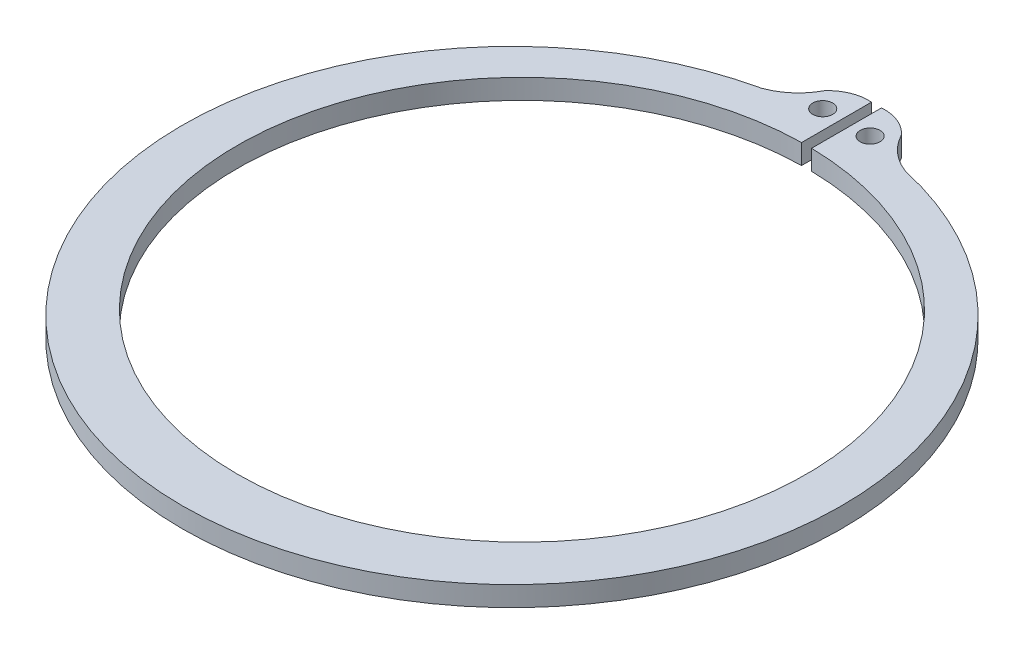
ISO-10303-21;
HEADER;
FILE_DESCRIPTION(('STEP AP214'),'2;1');
FILE_NAME('part.step','',(''),(''),'','','');
FILE_SCHEMA(('AUTOMOTIVE_DESIGN { 1 0 10303 214 1 1 1 1 }'));
ENDSEC;
DATA;
#1=APPLICATION_CONTEXT('core data for automotive mechanical design processes');
#2=APPLICATION_PROTOCOL_DEFINITION('international standard','automotive_design',2000,#1);
#3=PRODUCT_CONTEXT('',#1,'mechanical');
#4=PRODUCT('Part','Part','',(#3));
#5=PRODUCT_RELATED_PRODUCT_CATEGORY('part','',(#4));
#6=PRODUCT_DEFINITION_FORMATION('','',#4);
#7=PRODUCT_DEFINITION_CONTEXT('part definition',#1,'design');
#8=PRODUCT_DEFINITION('design','',#6,#7);
#9=PRODUCT_DEFINITION_SHAPE('','',#8);
#10=(LENGTH_UNIT() NAMED_UNIT(*) SI_UNIT(.MILLI.,.METRE.));
#11=(NAMED_UNIT(*) PLANE_ANGLE_UNIT() SI_UNIT($,.RADIAN.));
#12=(NAMED_UNIT(*) SI_UNIT($,.STERADIAN.) SOLID_ANGLE_UNIT());
#13=UNCERTAINTY_MEASURE_WITH_UNIT(LENGTH_MEASURE(1.E-05),#10,'distance_accuracy_value','');
#14=(GEOMETRIC_REPRESENTATION_CONTEXT(3) GLOBAL_UNCERTAINTY_ASSIGNED_CONTEXT((#13)) GLOBAL_UNIT_ASSIGNED_CONTEXT((#10,
#11,#12)) REPRESENTATION_CONTEXT('',''));
#15=CARTESIAN_POINT('',(0.,0.,0.));
#16=DIRECTION('',(0.,0.,1.));
#17=DIRECTION('',(1.,0.,0.));
#18=AXIS2_PLACEMENT_3D('',#15,#16,#17);
#19=CARTESIAN_POINT('',(-0.812688753312583,2.,-31.472507166047));
#20=DIRECTION('',(0.,-1.,0.));
#21=DIRECTION('',(0.,0.,-1.));
#22=AXIS2_PLACEMENT_3D('',#19,#20,#21);
#23=CYLINDRICAL_SURFACE('',#22,4.03523982190281);
#24=CARTESIAN_POINT('',(-0.812688753312583,0.,-31.472507166047));
#25=DIRECTION('',(0.,1.,0.));
#26=DIRECTION('',(0.,0.,1.));
#27=AXIS2_PLACEMENT_3D('',#24,#25,#26);
#28=CIRCLE('',#27,4.03523982190281);
#29=CARTESIAN_POINT('',(-0.5,0.,-35.49561369755));
#30=VERTEX_POINT('',#29);
#31=CARTESIAN_POINT('',(-3.84861750011484,0.,-34.1307579188185));
#32=VERTEX_POINT('',#31);
#33=EDGE_CURVE('E129',#30,#32,#28,.T.);
#34=ORIENTED_EDGE('',*,*,#33,.T.);
#35=DIRECTION('',(0.,-1.,0.));
#36=VECTOR('',#35,1.);
#37=CARTESIAN_POINT('',(-3.84861750011484,2.,-34.1307579188185));
#38=LINE('',#37,#36);
#39=CARTESIAN_POINT('',(-3.84861750011484,2.,-34.1307579188185));
#40=VERTEX_POINT('',#39);
#41=EDGE_CURVE('E11',#40,#32,#38,.T.);
#42=ORIENTED_EDGE('',*,*,#41,.F.);
#43=CARTESIAN_POINT('',(-0.812688753312583,2.,-31.472507166047));
#44=DIRECTION('',(0.,1.,0.));
#45=DIRECTION('',(0.,0.,1.));
#46=AXIS2_PLACEMENT_3D('',#43,#44,#45);
#47=CIRCLE('',#46,4.03523982190281);
#48=CARTESIAN_POINT('',(-0.5,2.,-35.49561369755));
#49=VERTEX_POINT('',#48);
#50=EDGE_CURVE('E144',#49,#40,#47,.T.);
#51=ORIENTED_EDGE('',*,*,#50,.F.);
#52=DIRECTION('',(0.,-1.,0.));
#53=VECTOR('',#52,1.);
#54=CARTESIAN_POINT('',(-0.5,2.,-35.49561369755));
#55=LINE('',#54,#53);
#56=EDGE_CURVE('E125',#49,#30,#55,.T.);
#57=ORIENTED_EDGE('',*,*,#56,.T.);
#58=EDGE_LOOP('',(#34,#42,#51,#57));
#59=FACE_BOUND('',#58,.T.);
#60=ADVANCED_FACE('F33',(#59),#23,.T.);
#61=CARTESIAN_POINT('',(-9.34814744340769,2.,-37.0386555394674));
#62=DIRECTION('',(0.,-1.,0.));
#63=DIRECTION('',(0.,0.,-1.));
#64=AXIS2_PLACEMENT_3D('',#61,#62,#63);
#65=CYLINDRICAL_SURFACE('',#64,6.22098852027157);
#66=CARTESIAN_POINT('',(-9.34814744340769,0.,-37.0386555394674));
#67=DIRECTION('',(0.,-1.,0.));
#68=DIRECTION('',(0.,0.,-1.));
#69=AXIS2_PLACEMENT_3D('',#66,#67,#68);
#70=CIRCLE('',#69,6.22098852027157);
#71=CARTESIAN_POINT('',(-7.16857951198491,0.,-31.2119770858659));
#72=VERTEX_POINT('',#71);
#73=EDGE_CURVE('E132',#32,#72,#70,.T.);
#74=ORIENTED_EDGE('',*,*,#73,.T.);
#75=DIRECTION('',(0.,-1.,0.));
#76=VECTOR('',#75,1.);
#77=CARTESIAN_POINT('',(-7.16857951198491,2.,-31.2119770858659));
#78=LINE('',#77,#76);
#79=CARTESIAN_POINT('',(-7.16857951198491,2.,-31.2119770858659));
#80=VERTEX_POINT('',#79);
#81=EDGE_CURVE('E41',#80,#72,#78,.T.);
#82=ORIENTED_EDGE('',*,*,#81,.F.);
#83=CARTESIAN_POINT('',(-9.34814744340769,2.,-37.0386555394674));
#84=DIRECTION('',(0.,-1.,0.));
#85=DIRECTION('',(0.,0.,-1.));
#86=AXIS2_PLACEMENT_3D('',#83,#84,#85);
#87=CIRCLE('',#86,6.22098852027157);
#88=EDGE_CURVE('E92',#40,#80,#87,.T.);
#89=ORIENTED_EDGE('',*,*,#88,.F.);
#90=ORIENTED_EDGE('',*,*,#41,.T.);
#91=EDGE_LOOP('',(#74,#82,#89,#90));
#92=FACE_BOUND('',#91,.T.);
#93=ADVANCED_FACE('F213',(#92),#65,.F.);
#94=CARTESIAN_POINT('',(0.,2.,0.999999999999992));
#95=DIRECTION('',(0.,-1.,0.));
#96=DIRECTION('',(0.,0.,-1.));
#97=AXIS2_PLACEMENT_3D('',#94,#95,#96);
#98=CYLINDRICAL_SURFACE('',#97,33.);
#99=CARTESIAN_POINT('',(0.,0.,0.999999999999992));
#100=DIRECTION('',(0.,1.,0.));
#101=DIRECTION('',(0.,0.,1.));
#102=AXIS2_PLACEMENT_3D('',#99,#100,#101);
#103=CIRCLE('',#102,33.);
#104=CARTESIAN_POINT('',(7.16857951198493,0.,-31.2119770858659));
#105=VERTEX_POINT('',#104);
#106=EDGE_CURVE('E135',#72,#105,#103,.T.);
#107=ORIENTED_EDGE('',*,*,#106,.T.);
#108=DIRECTION('',(0.,-1.,0.));
#109=VECTOR('',#108,1.);
#110=CARTESIAN_POINT('',(7.16857951198493,2.,-31.2119770858659));
#111=LINE('',#110,#109);
#112=CARTESIAN_POINT('',(7.16857951198493,2.,-31.2119770858659));
#113=VERTEX_POINT('',#112);
#114=EDGE_CURVE('E151',#113,#105,#111,.T.);
#115=ORIENTED_EDGE('',*,*,#114,.F.);
#116=CARTESIAN_POINT('',(0.,2.,0.999999999999992));
#117=DIRECTION('',(0.,1.,0.));
#118=DIRECTION('',(0.,0.,1.));
#119=AXIS2_PLACEMENT_3D('',#116,#117,#118);
#120=CIRCLE('',#119,33.);
#121=EDGE_CURVE('E159',#80,#113,#120,.T.);
#122=ORIENTED_EDGE('',*,*,#121,.F.);
#123=ORIENTED_EDGE('',*,*,#81,.T.);
#124=EDGE_LOOP('',(#107,#115,#122,#123));
#125=FACE_BOUND('',#124,.T.);
#126=ADVANCED_FACE('F157',(#125),#98,.T.);
#127=CARTESIAN_POINT('',(9.34814744340769,2.,-37.0386555394674));
#128=DIRECTION('',(0.,-1.,0.));
#129=DIRECTION('',(0.,0.,-1.));
#130=AXIS2_PLACEMENT_3D('',#127,#128,#129);
#131=CYLINDRICAL_SURFACE('',#130,6.22098852027157);
#132=CARTESIAN_POINT('',(9.34814744340769,0.,-37.0386555394674));
#133=DIRECTION('',(0.,-1.,0.));
#134=DIRECTION('',(0.,0.,1.));
#135=AXIS2_PLACEMENT_3D('',#132,#133,#134);
#136=CIRCLE('',#135,6.22098852027157);
#137=CARTESIAN_POINT('',(3.84861750011484,0.,-34.1307579188185));
#138=VERTEX_POINT('',#137);
#139=EDGE_CURVE('E137',#105,#138,#136,.T.);
#140=ORIENTED_EDGE('',*,*,#139,.T.);
#141=DIRECTION('',(0.,-1.,0.));
#142=VECTOR('',#141,1.);
#143=CARTESIAN_POINT('',(3.84861750011484,2.,-34.1307579188185));
#144=LINE('',#143,#142);
#145=CARTESIAN_POINT('',(3.84861750011484,2.,-34.1307579188185));
#146=VERTEX_POINT('',#145);
#147=EDGE_CURVE('E148',#146,#138,#144,.T.);
#148=ORIENTED_EDGE('',*,*,#147,.F.);
#149=CARTESIAN_POINT('',(9.34814744340769,2.,-37.0386555394674));
#150=DIRECTION('',(0.,-1.,0.));
#151=DIRECTION('',(0.,0.,1.));
#152=AXIS2_PLACEMENT_3D('',#149,#150,#151);
#153=CIRCLE('',#152,6.22098852027157);
#154=EDGE_CURVE('E171',#113,#146,#153,.T.);
#155=ORIENTED_EDGE('',*,*,#154,.F.);
#156=ORIENTED_EDGE('',*,*,#114,.T.);
#157=EDGE_LOOP('',(#140,#148,#155,#156));
#158=FACE_BOUND('',#157,.T.);
#159=ADVANCED_FACE('F167',(#158),#131,.F.);
#160=CARTESIAN_POINT('',(0.812688753312583,2.,-31.472507166047));
#161=DIRECTION('',(0.,-1.,0.));
#162=DIRECTION('',(0.,0.,-1.));
#163=AXIS2_PLACEMENT_3D('',#160,#161,#162);
#164=CYLINDRICAL_SURFACE('',#163,4.03523982190281);
#165=CARTESIAN_POINT('',(0.812688753312583,0.,-31.472507166047));
#166=DIRECTION('',(0.,1.,0.));
#167=DIRECTION('',(0.,0.,-1.));
#168=AXIS2_PLACEMENT_3D('',#165,#166,#167);
#169=CIRCLE('',#168,4.03523982190281);
#170=CARTESIAN_POINT('',(0.5,0.,-35.49561369755));
#171=VERTEX_POINT('',#170);
#172=EDGE_CURVE('E139',#138,#171,#169,.T.);
#173=ORIENTED_EDGE('',*,*,#172,.T.);
#174=DIRECTION('',(0.,-1.,0.));
#175=VECTOR('',#174,1.);
#176=CARTESIAN_POINT('',(0.5,2.,-35.49561369755));
#177=LINE('',#176,#175);
#178=CARTESIAN_POINT('',(0.5,2.,-35.49561369755));
#179=VERTEX_POINT('',#178);
#180=EDGE_CURVE('E120',#179,#171,#177,.T.);
#181=ORIENTED_EDGE('',*,*,#180,.F.);
#182=CARTESIAN_POINT('',(0.812688753312583,2.,-31.472507166047));
#183=DIRECTION('',(0.,1.,0.));
#184=DIRECTION('',(0.,0.,-1.));
#185=AXIS2_PLACEMENT_3D('',#182,#183,#184);
#186=CIRCLE('',#185,4.03523982190281);
#187=EDGE_CURVE('E111',#146,#179,#186,.T.);
#188=ORIENTED_EDGE('',*,*,#187,.F.);
#189=ORIENTED_EDGE('',*,*,#147,.T.);
#190=EDGE_LOOP('',(#173,#181,#188,#189));
#191=FACE_BOUND('',#190,.T.);
#192=ADVANCED_FACE('F170',(#191),#164,.T.);
#193=CARTESIAN_POINT('',(0.5,2.,-35.49561369755));
#194=DIRECTION('',(1.,0.,0.));
#195=DIRECTION('',(0.,0.,-1.));
#196=AXIS2_PLACEMENT_3D('',#193,#194,#195);
#197=PLANE('',#196);
#198=DIRECTION('',(0.,0.,1.));
#199=VECTOR('',#198,1.);
#200=CARTESIAN_POINT('',(0.5,0.,-35.49561369755));
#201=LINE('',#200,#199);
#202=CARTESIAN_POINT('',(0.500000000000001,0.,-28.49561369755));
#203=VERTEX_POINT('',#202);
#204=EDGE_CURVE('E119',#171,#203,#201,.T.);
#205=ORIENTED_EDGE('',*,*,#204,.T.);
#206=DIRECTION('',(0.,-1.,0.));
#207=VECTOR('',#206,1.);
#208=CARTESIAN_POINT('',(0.500000000000001,2.,-28.49561369755));
#209=LINE('',#208,#207);
#210=CARTESIAN_POINT('',(0.500000000000001,2.,-28.49561369755));
#211=VERTEX_POINT('',#210);
#212=EDGE_CURVE('E116',#211,#203,#209,.T.);
#213=ORIENTED_EDGE('',*,*,#212,.F.);
#214=DIRECTION('',(0.,0.,1.));
#215=VECTOR('',#214,1.);
#216=CARTESIAN_POINT('',(0.5,2.,-35.49561369755));
#217=LINE('',#216,#215);
#218=EDGE_CURVE('E105',#179,#211,#217,.T.);
#219=ORIENTED_EDGE('',*,*,#218,.F.);
#220=ORIENTED_EDGE('',*,*,#180,.T.);
#221=EDGE_LOOP('',(#205,#213,#219,#220));
#222=FACE_BOUND('',#221,.T.);
#223=ADVANCED_FACE('F117',(#222),#197,.F.);
#224=CARTESIAN_POINT('',(0.,2.,0.));
#225=DIRECTION('',(0.,-1.,0.));
#226=DIRECTION('',(0.,0.,-1.));
#227=AXIS2_PLACEMENT_3D('',#224,#225,#226);
#228=CYLINDRICAL_SURFACE('',#227,28.5);
#229=CARTESIAN_POINT('',(0.,0.,0.));
#230=DIRECTION('',(0.,-1.,0.));
#231=DIRECTION('',(0.,0.,1.));
#232=AXIS2_PLACEMENT_3D('',#229,#230,#231);
#233=CIRCLE('',#232,28.5);
#234=CARTESIAN_POINT('',(-0.5,0.,-28.49561369755));
#235=VERTEX_POINT('',#234);
#236=EDGE_CURVE('E78',#203,#235,#233,.T.);
#237=ORIENTED_EDGE('',*,*,#236,.T.);
#238=DIRECTION('',(0.,-1.,0.));
#239=VECTOR('',#238,1.);
#240=CARTESIAN_POINT('',(-0.5,2.,-28.49561369755));
#241=LINE('',#240,#239);
#242=CARTESIAN_POINT('',(-0.5,2.,-28.49561369755));
#243=VERTEX_POINT('',#242);
#244=EDGE_CURVE('E121',#243,#235,#241,.T.);
#245=ORIENTED_EDGE('',*,*,#244,.F.);
#246=CARTESIAN_POINT('',(0.,2.,0.));
#247=DIRECTION('',(0.,-1.,0.));
#248=DIRECTION('',(0.,0.,1.));
#249=AXIS2_PLACEMENT_3D('',#246,#247,#248);
#250=CIRCLE('',#249,28.5);
#251=EDGE_CURVE('E109',#211,#243,#250,.T.);
#252=ORIENTED_EDGE('',*,*,#251,.F.);
#253=ORIENTED_EDGE('',*,*,#212,.T.);
#254=EDGE_LOOP('',(#237,#245,#252,#253));
#255=FACE_BOUND('',#254,.T.);
#256=ADVANCED_FACE('F123',(#255),#228,.F.);
#257=CARTESIAN_POINT('',(-0.5,2.,-35.49561369755));
#258=DIRECTION('',(-1.,0.,0.));
#259=DIRECTION('',(0.,0.,1.));
#260=AXIS2_PLACEMENT_3D('',#257,#258,#259);
#261=PLANE('',#260);
#262=DIRECTION('',(0.,0.,-1.));
#263=VECTOR('',#262,1.);
#264=CARTESIAN_POINT('',(-0.5,0.,-35.49561369755));
#265=LINE('',#264,#263);
#266=EDGE_CURVE('E84',#235,#30,#265,.T.);
#267=ORIENTED_EDGE('',*,*,#266,.T.);
#268=ORIENTED_EDGE('',*,*,#56,.F.);
#269=DIRECTION('',(0.,0.,-1.));
#270=VECTOR('',#269,1.);
#271=CARTESIAN_POINT('',(-0.5,2.,-35.49561369755));
#272=LINE('',#271,#270);
#273=EDGE_CURVE('E49',#243,#49,#272,.T.);
#274=ORIENTED_EDGE('',*,*,#273,.F.);
#275=ORIENTED_EDGE('',*,*,#244,.T.);
#276=EDGE_LOOP('',(#267,#268,#274,#275));
#277=FACE_BOUND('',#276,.T.);
#278=ADVANCED_FACE('F200',(#277),#261,.F.);
#279=CARTESIAN_POINT('',(-0.812688753312583,2.,-31.472507166047));
#280=DIRECTION('',(0.,1.,0.));
#281=DIRECTION('',(0.,0.,1.));
#282=AXIS2_PLACEMENT_3D('',#279,#280,#281);
#283=PLANE('',#282);
#284=CARTESIAN_POINT('',(2.37310312359219,2.,-32.4842436757352));
#285=DIRECTION('',(0.,1.,0.));
#286=DIRECTION('',(0.,0.,-1.));
#287=AXIS2_PLACEMENT_3D('',#284,#285,#286);
#288=CIRCLE('',#287,0.995647448698265);
#289=CARTESIAN_POINT('',(2.37310312359219,2.,-33.4798911244335));
#290=VERTEX_POINT('',#289);
#291=EDGE_CURVE('E183',#290,#290,#288,.T.);
#292=ORIENTED_EDGE('',*,*,#291,.F.);
#293=EDGE_LOOP('',(#292));
#294=FACE_BOUND('',#293,.T.);
#295=CARTESIAN_POINT('',(-2.37310312359219,2.,-32.4842436757352));
#296=DIRECTION('',(0.,1.,0.));
#297=DIRECTION('',(0.,0.,1.));
#298=AXIS2_PLACEMENT_3D('',#295,#296,#297);
#299=CIRCLE('',#298,0.995647448698265);
#300=CARTESIAN_POINT('',(-2.37310312359219,2.,-31.4885962270369));
#301=VERTEX_POINT('',#300);
#302=EDGE_CURVE('E177',#301,#301,#299,.T.);
#303=ORIENTED_EDGE('',*,*,#302,.F.);
#304=EDGE_LOOP('',(#303));
#305=FACE_BOUND('',#304,.T.);
#306=ORIENTED_EDGE('',*,*,#50,.T.);
#307=ORIENTED_EDGE('',*,*,#88,.T.);
#308=ORIENTED_EDGE('',*,*,#121,.T.);
#309=ORIENTED_EDGE('',*,*,#154,.T.);
#310=ORIENTED_EDGE('',*,*,#187,.T.);
#311=ORIENTED_EDGE('',*,*,#218,.T.);
#312=ORIENTED_EDGE('',*,*,#251,.T.);
#313=ORIENTED_EDGE('',*,*,#273,.T.);
#314=EDGE_LOOP('',(#306,#307,#308,#309,#310,#311,#312,#313));
#315=FACE_BOUND('',#314,.T.);
#316=ADVANCED_FACE('F107',(#294,#305,#315),#283,.T.);
#317=CARTESIAN_POINT('',(-0.812688753312583,0.,-31.472507166047));
#318=DIRECTION('',(0.,1.,0.));
#319=DIRECTION('',(0.,0.,1.));
#320=AXIS2_PLACEMENT_3D('',#317,#318,#319);
#321=PLANE('',#320);
#322=CARTESIAN_POINT('',(2.37310312359219,0.,-32.4842436757352));
#323=DIRECTION('',(0.,1.,0.));
#324=DIRECTION('',(0.,0.,-1.));
#325=AXIS2_PLACEMENT_3D('',#322,#323,#324);
#326=CIRCLE('',#325,0.995647448698265);
#327=CARTESIAN_POINT('',(2.37310312359219,0.,-33.4798911244335));
#328=VERTEX_POINT('',#327);
#329=EDGE_CURVE('E180',#328,#328,#326,.T.);
#330=ORIENTED_EDGE('',*,*,#329,.T.);
#331=EDGE_LOOP('',(#330));
#332=FACE_BOUND('',#331,.T.);
#333=CARTESIAN_POINT('',(-2.37310312359219,0.,-32.4842436757352));
#334=DIRECTION('',(0.,1.,0.));
#335=DIRECTION('',(0.,0.,1.));
#336=AXIS2_PLACEMENT_3D('',#333,#334,#335);
#337=CIRCLE('',#336,0.995647448698265);
#338=CARTESIAN_POINT('',(-2.37310312359219,0.,-31.4885962270369));
#339=VERTEX_POINT('',#338);
#340=EDGE_CURVE('E133',#339,#339,#337,.T.);
#341=ORIENTED_EDGE('',*,*,#340,.T.);
#342=EDGE_LOOP('',(#341));
#343=FACE_BOUND('',#342,.T.);
#344=ORIENTED_EDGE('',*,*,#33,.F.);
#345=ORIENTED_EDGE('',*,*,#266,.F.);
#346=ORIENTED_EDGE('',*,*,#236,.F.);
#347=ORIENTED_EDGE('',*,*,#204,.F.);
#348=ORIENTED_EDGE('',*,*,#172,.F.);
#349=ORIENTED_EDGE('',*,*,#139,.F.);
#350=ORIENTED_EDGE('',*,*,#106,.F.);
#351=ORIENTED_EDGE('',*,*,#73,.F.);
#352=EDGE_LOOP('',(#344,#345,#346,#347,#348,#349,#350,#351));
#353=FACE_BOUND('',#352,.T.);
#354=ADVANCED_FACE('F163',(#332,#343,#353),#321,.F.);
#355=CARTESIAN_POINT('',(-2.37310312359219,0.,-32.4842436757352));
#356=DIRECTION('',(0.,1.,0.));
#357=DIRECTION('',(0.,0.,1.));
#358=AXIS2_PLACEMENT_3D('',#355,#356,#357);
#359=CYLINDRICAL_SURFACE('',#358,0.995647448698265);
#360=ORIENTED_EDGE('',*,*,#340,.F.);
#361=EDGE_LOOP('',(#360));
#362=FACE_BOUND('',#361,.T.);
#363=ORIENTED_EDGE('',*,*,#302,.T.);
#364=EDGE_LOOP('',(#363));
#365=FACE_BOUND('',#364,.T.);
#366=ADVANCED_FACE('F194',(#362,#365),#359,.F.);
#367=CARTESIAN_POINT('',(2.37310312359219,0.,-32.4842436757352));
#368=DIRECTION('',(0.,1.,0.));
#369=DIRECTION('',(0.,0.,1.));
#370=AXIS2_PLACEMENT_3D('',#367,#368,#369);
#371=CYLINDRICAL_SURFACE('',#370,0.995647448698265);
#372=ORIENTED_EDGE('',*,*,#329,.F.);
#373=EDGE_LOOP('',(#372));
#374=FACE_BOUND('',#373,.T.);
#375=ORIENTED_EDGE('',*,*,#291,.T.);
#376=EDGE_LOOP('',(#375));
#377=FACE_BOUND('',#376,.T.);
#378=ADVANCED_FACE('F191',(#374,#377),#371,.F.);
#379=CLOSED_SHELL('',(#60,#93,#126,#159,#192,#223,#256,#278,#316,#354,#366,#378));
#380=MANIFOLD_SOLID_BREP('B2',#379);
#381=ADVANCED_BREP_SHAPE_REPRESENTATION('',(#18,#380),#14);
#382=SHAPE_DEFINITION_REPRESENTATION(#9,#381);
ENDSEC;
END-ISO-10303-21;
